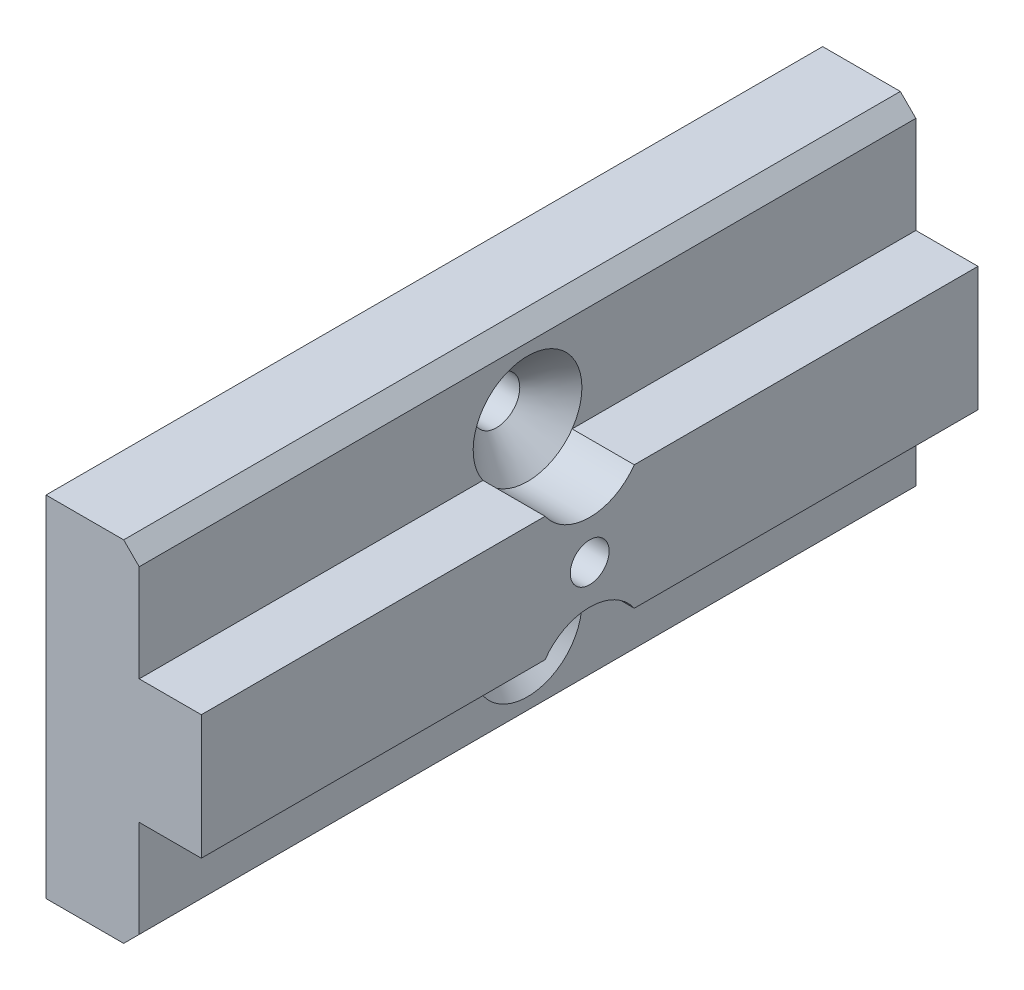
ISO-10303-21;
HEADER;
FILE_DESCRIPTION(('STEP AP214'),'2;1');
FILE_NAME('part.step','',(''),(''),'','','');
FILE_SCHEMA(('AUTOMOTIVE_DESIGN { 1 0 10303 214 1 1 1 1 }'));
ENDSEC;
DATA;
#1=APPLICATION_CONTEXT('core data for automotive mechanical design processes');
#2=APPLICATION_PROTOCOL_DEFINITION('international standard','automotive_design',2000,#1);
#3=PRODUCT_CONTEXT('',#1,'mechanical');
#4=PRODUCT('Part','Part','',(#3));
#5=PRODUCT_RELATED_PRODUCT_CATEGORY('part','',(#4));
#6=PRODUCT_DEFINITION_FORMATION('','',#4);
#7=PRODUCT_DEFINITION_CONTEXT('part definition',#1,'design');
#8=PRODUCT_DEFINITION('design','',#6,#7);
#9=PRODUCT_DEFINITION_SHAPE('','',#8);
#10=(LENGTH_UNIT() NAMED_UNIT(*) SI_UNIT(.MILLI.,.METRE.));
#11=(NAMED_UNIT(*) PLANE_ANGLE_UNIT() SI_UNIT($,.RADIAN.));
#12=(NAMED_UNIT(*) SI_UNIT($,.STERADIAN.) SOLID_ANGLE_UNIT());
#13=UNCERTAINTY_MEASURE_WITH_UNIT(LENGTH_MEASURE(1.E-05),#10,'distance_accuracy_value','');
#14=(GEOMETRIC_REPRESENTATION_CONTEXT(3) GLOBAL_UNCERTAINTY_ASSIGNED_CONTEXT((#13)) GLOBAL_UNIT_ASSIGNED_CONTEXT((#10,
#11,#12)) REPRESENTATION_CONTEXT('',''));
#15=CARTESIAN_POINT('',(0.,0.,0.));
#16=DIRECTION('',(0.,0.,1.));
#17=DIRECTION('',(1.,0.,0.));
#18=AXIS2_PLACEMENT_3D('',#15,#16,#17);
#19=CARTESIAN_POINT('',(10.,-4.,-25.));
#20=DIRECTION('',(0.,1.,0.));
#21=DIRECTION('',(0.,0.,1.));
#22=AXIS2_PLACEMENT_3D('',#19,#20,#21);
#23=PLANE('',#22);
#24=DIRECTION('',(-1.,0.,0.));
#25=VECTOR('',#24,1.);
#26=CARTESIAN_POINT('',(10.,-4.,-2.87228132326901));
#27=LINE('',#26,#25);
#28=CARTESIAN_POINT('',(6.,-4.,-2.87228132326901));
#29=VERTEX_POINT('',#28);
#30=CARTESIAN_POINT('',(10.,-4.,-2.87228132326901));
#31=VERTEX_POINT('',#30);
#32=EDGE_CURVE('E298',#29,#31,#27,.F.);
#33=ORIENTED_EDGE('',*,*,#32,.F.);
#34=DIRECTION('',(0.,0.,-1.));
#35=VECTOR('',#34,1.);
#36=CARTESIAN_POINT('',(6.,-4.,-25.));
#37=LINE('',#36,#35);
#38=CARTESIAN_POINT('',(6.,-4.,-25.));
#39=VERTEX_POINT('',#38);
#40=EDGE_CURVE('E184',#29,#39,#37,.T.);
#41=ORIENTED_EDGE('',*,*,#40,.T.);
#42=DIRECTION('',(-1.,0.,0.));
#43=VECTOR('',#42,1.);
#44=CARTESIAN_POINT('',(10.,-4.,-25.));
#45=LINE('',#44,#43);
#46=CARTESIAN_POINT('',(10.,-4.,-25.));
#47=VERTEX_POINT('',#46);
#48=EDGE_CURVE('E196',#47,#39,#45,.T.);
#49=ORIENTED_EDGE('',*,*,#48,.F.);
#50=DIRECTION('',(0.,0.,-1.));
#51=VECTOR('',#50,1.);
#52=CARTESIAN_POINT('',(10.,-4.,-25.));
#53=LINE('',#52,#51);
#54=EDGE_CURVE('E277',#31,#47,#53,.T.);
#55=ORIENTED_EDGE('',*,*,#54,.F.);
#56=EDGE_LOOP('',(#33,#41,#49,#55));
#57=FACE_BOUND('',#56,.T.);
#58=ADVANCED_FACE('F38',(#57),#23,.F.);
#59=DIRECTION('',(-1.,0.,0.));
#60=VECTOR('',#59,1.);
#61=CARTESIAN_POINT('',(10.,-4.,2.87228132326902));
#62=LINE('',#61,#60);
#63=CARTESIAN_POINT('',(10.,-4.,2.87228132326902));
#64=VERTEX_POINT('',#63);
#65=CARTESIAN_POINT('',(6.,-4.,2.87228132326902));
#66=VERTEX_POINT('',#65);
#67=EDGE_CURVE('E294',#64,#66,#62,.T.);
#68=ORIENTED_EDGE('',*,*,#67,.F.);
#69=CARTESIAN_POINT('',(10.,-4.,25.));
#70=VERTEX_POINT('',#69);
#71=EDGE_CURVE('E280',#70,#64,#53,.T.);
#72=ORIENTED_EDGE('',*,*,#71,.F.);
#73=DIRECTION('',(-1.,0.,0.));
#74=VECTOR('',#73,1.);
#75=CARTESIAN_POINT('',(10.,-4.,25.));
#76=LINE('',#75,#74);
#77=CARTESIAN_POINT('',(6.,-4.,25.));
#78=VERTEX_POINT('',#77);
#79=EDGE_CURVE('E200',#70,#78,#76,.T.);
#80=ORIENTED_EDGE('',*,*,#79,.T.);
#81=EDGE_CURVE('E178',#78,#66,#37,.T.);
#82=ORIENTED_EDGE('',*,*,#81,.T.);
#83=EDGE_LOOP('',(#68,#72,#80,#82));
#84=FACE_BOUND('',#83,.T.);
#85=ADVANCED_FACE('F360',(#84),#23,.F.);
#86=CARTESIAN_POINT('',(10.,4.,-25.));
#87=DIRECTION('',(0.,-1.,0.));
#88=DIRECTION('',(0.,0.,-1.));
#89=AXIS2_PLACEMENT_3D('',#86,#87,#88);
#90=PLANE('',#89);
#91=DIRECTION('',(-1.,0.,0.));
#92=VECTOR('',#91,1.);
#93=CARTESIAN_POINT('',(10.,4.,2.87228132326902));
#94=LINE('',#93,#92);
#95=CARTESIAN_POINT('',(6.,4.,2.87228132326902));
#96=VERTEX_POINT('',#95);
#97=CARTESIAN_POINT('',(10.,4.,2.87228132326902));
#98=VERTEX_POINT('',#97);
#99=EDGE_CURVE('E153',#96,#98,#94,.F.);
#100=ORIENTED_EDGE('',*,*,#99,.F.);
#101=DIRECTION('',(0.,0.,1.));
#102=VECTOR('',#101,1.);
#103=CARTESIAN_POINT('',(6.,4.,-25.));
#104=LINE('',#103,#102);
#105=CARTESIAN_POINT('',(6.,4.,25.));
#106=VERTEX_POINT('',#105);
#107=EDGE_CURVE('E167',#96,#106,#104,.T.);
#108=ORIENTED_EDGE('',*,*,#107,.T.);
#109=DIRECTION('',(-1.,0.,0.));
#110=VECTOR('',#109,1.);
#111=CARTESIAN_POINT('',(10.,4.,25.));
#112=LINE('',#111,#110);
#113=CARTESIAN_POINT('',(10.,4.,25.));
#114=VERTEX_POINT('',#113);
#115=EDGE_CURVE('E188',#114,#106,#112,.T.);
#116=ORIENTED_EDGE('',*,*,#115,.F.);
#117=DIRECTION('',(0.,0.,1.));
#118=VECTOR('',#117,1.);
#119=CARTESIAN_POINT('',(10.,4.,-25.));
#120=LINE('',#119,#118);
#121=EDGE_CURVE('E169',#98,#114,#120,.T.);
#122=ORIENTED_EDGE('',*,*,#121,.F.);
#123=EDGE_LOOP('',(#100,#108,#116,#122));
#124=FACE_BOUND('',#123,.T.);
#125=ADVANCED_FACE('F165',(#124),#90,.F.);
#126=DIRECTION('',(-1.,0.,0.));
#127=VECTOR('',#126,1.);
#128=CARTESIAN_POINT('',(10.,4.,-2.87228132326901));
#129=LINE('',#128,#127);
#130=CARTESIAN_POINT('',(10.,4.,-2.87228132326901));
#131=VERTEX_POINT('',#130);
#132=CARTESIAN_POINT('',(6.,4.,-2.87228132326901));
#133=VERTEX_POINT('',#132);
#134=EDGE_CURVE('E156',#131,#133,#129,.T.);
#135=ORIENTED_EDGE('',*,*,#134,.F.);
#136=CARTESIAN_POINT('',(10.,4.,-25.));
#137=VERTEX_POINT('',#136);
#138=EDGE_CURVE('E192',#137,#131,#120,.T.);
#139=ORIENTED_EDGE('',*,*,#138,.F.);
#140=DIRECTION('',(-1.,0.,0.));
#141=VECTOR('',#140,1.);
#142=CARTESIAN_POINT('',(10.,4.,-25.));
#143=LINE('',#142,#141);
#144=CARTESIAN_POINT('',(6.,4.,-25.));
#145=VERTEX_POINT('',#144);
#146=EDGE_CURVE('E191',#137,#145,#143,.T.);
#147=ORIENTED_EDGE('',*,*,#146,.T.);
#148=EDGE_CURVE('E177',#145,#133,#104,.T.);
#149=ORIENTED_EDGE('',*,*,#148,.T.);
#150=EDGE_LOOP('',(#135,#139,#147,#149));
#151=FACE_BOUND('',#150,.T.);
#152=ADVANCED_FACE('F377',(#151),#90,.F.);
#153=CARTESIAN_POINT('',(6.,0.,0.));
#154=DIRECTION('',(1.,0.,0.));
#155=DIRECTION('',(0.,0.,-1.));
#156=AXIS2_PLACEMENT_3D('',#153,#154,#155);
#157=PLANE('',#156);
#158=DIRECTION('',(0.,1.,0.));
#159=VECTOR('',#158,1.);
#160=CARTESIAN_POINT('',(6.,-11.25,-25.));
#161=LINE('',#160,#159);
#162=CARTESIAN_POINT('',(6.,10.25,-25.));
#163=VERTEX_POINT('',#162);
#164=EDGE_CURVE('E207',#145,#163,#161,.T.);
#165=ORIENTED_EDGE('',*,*,#164,.T.);
#166=DIRECTION('',(0.,0.,1.));
#167=VECTOR('',#166,1.);
#168=CARTESIAN_POINT('',(6.,10.25,25.));
#169=LINE('',#168,#167);
#170=CARTESIAN_POINT('',(6.,10.25,25.));
#171=VERTEX_POINT('',#170);
#172=EDGE_CURVE('E47',#163,#171,#169,.T.);
#173=ORIENTED_EDGE('',*,*,#172,.T.);
#174=DIRECTION('',(0.,-1.,0.));
#175=VECTOR('',#174,1.);
#176=CARTESIAN_POINT('',(6.,-11.25,25.));
#177=LINE('',#176,#175);
#178=EDGE_CURVE('E175',#171,#106,#177,.T.);
#179=ORIENTED_EDGE('',*,*,#178,.T.);
#180=ORIENTED_EDGE('',*,*,#107,.F.);
#181=CARTESIAN_POINT('',(6.,6.,0.));
#182=DIRECTION('',(1.,0.,0.));
#183=DIRECTION('',(0.,0.,-1.));
#184=AXIS2_PLACEMENT_3D('',#181,#182,#183);
#185=CIRCLE('',#184,3.50000000000002);
#186=EDGE_CURVE('E138',#96,#133,#185,.F.);
#187=ORIENTED_EDGE('',*,*,#186,.T.);
#188=ORIENTED_EDGE('',*,*,#148,.F.);
#189=EDGE_LOOP('',(#165,#173,#179,#180,#187,#188));
#190=FACE_BOUND('',#189,.T.);
#191=ADVANCED_FACE('F174',(#190),#157,.T.);
#192=CARTESIAN_POINT('',(6.,-11.25,25.));
#193=DIRECTION('',(0.,0.,-1.));
#194=DIRECTION('',(-1.,0.,0.));
#195=AXIS2_PLACEMENT_3D('',#192,#193,#194);
#196=PLANE('',#195);
#197=DIRECTION('',(-1.,0.,0.));
#198=VECTOR('',#197,1.);
#199=CARTESIAN_POINT('',(6.,-11.25,25.));
#200=LINE('',#199,#198);
#201=CARTESIAN_POINT('',(4.99999999999999,-11.25,25.));
#202=VERTEX_POINT('',#201);
#203=CARTESIAN_POINT('',(0.,-11.25,25.));
#204=VERTEX_POINT('',#203);
#205=EDGE_CURVE('E236',#202,#204,#200,.T.);
#206=ORIENTED_EDGE('',*,*,#205,.F.);
#207=DIRECTION('',(0.707106781186547,0.707106781186548,0.));
#208=VECTOR('',#207,1.);
#209=CARTESIAN_POINT('',(6.,-10.25,25.));
#210=LINE('',#209,#208);
#211=CARTESIAN_POINT('',(6.,-10.25,25.));
#212=VERTEX_POINT('',#211);
#213=EDGE_CURVE('E263',#202,#212,#210,.T.);
#214=ORIENTED_EDGE('',*,*,#213,.T.);
#215=EDGE_CURVE('E208',#78,#212,#177,.T.);
#216=ORIENTED_EDGE('',*,*,#215,.F.);
#217=ORIENTED_EDGE('',*,*,#79,.F.);
#218=DIRECTION('',(0.,-1.,0.));
#219=VECTOR('',#218,1.);
#220=CARTESIAN_POINT('',(10.,-4.,25.));
#221=LINE('',#220,#219);
#222=EDGE_CURVE('E182',#114,#70,#221,.T.);
#223=ORIENTED_EDGE('',*,*,#222,.F.);
#224=ORIENTED_EDGE('',*,*,#115,.T.);
#225=ORIENTED_EDGE('',*,*,#178,.F.);
#226=DIRECTION('',(-0.707106781186548,0.707106781186548,0.));
#227=VECTOR('',#226,1.);
#228=CARTESIAN_POINT('',(6.,10.25,25.));
#229=LINE('',#228,#227);
#230=CARTESIAN_POINT('',(5.,11.25,25.));
#231=VERTEX_POINT('',#230);
#232=EDGE_CURVE('E54',#171,#231,#229,.T.);
#233=ORIENTED_EDGE('',*,*,#232,.T.);
#234=DIRECTION('',(-1.,0.,0.));
#235=VECTOR('',#234,1.);
#236=CARTESIAN_POINT('',(6.,11.25,25.));
#237=LINE('',#236,#235);
#238=CARTESIAN_POINT('',(0.,11.25,25.));
#239=VERTEX_POINT('',#238);
#240=EDGE_CURVE('E212',#231,#239,#237,.T.);
#241=ORIENTED_EDGE('',*,*,#240,.T.);
#242=DIRECTION('',(0.,-1.,0.));
#243=VECTOR('',#242,1.);
#244=CARTESIAN_POINT('',(0.,-11.25,25.));
#245=LINE('',#244,#243);
#246=EDGE_CURVE('E204',#239,#204,#245,.T.);
#247=ORIENTED_EDGE('',*,*,#246,.T.);
#248=EDGE_LOOP('',(#206,#214,#216,#217,#223,#224,#225,#233,#241,#247));
#249=FACE_BOUND('',#248,.T.);
#250=ADVANCED_FACE('F269',(#249),#196,.F.);
#251=CARTESIAN_POINT('',(6.,-11.25,-25.));
#252=DIRECTION('',(0.,1.,0.));
#253=DIRECTION('',(0.,0.,1.));
#254=AXIS2_PLACEMENT_3D('',#251,#252,#253);
#255=PLANE('',#254);
#256=DIRECTION('',(-1.,0.,0.));
#257=VECTOR('',#256,1.);
#258=CARTESIAN_POINT('',(6.,-11.25,-25.));
#259=LINE('',#258,#257);
#260=CARTESIAN_POINT('',(4.99999999999999,-11.25,-25.));
#261=VERTEX_POINT('',#260);
#262=CARTESIAN_POINT('',(0.,-11.25,-25.));
#263=VERTEX_POINT('',#262);
#264=EDGE_CURVE('E233',#261,#263,#259,.T.);
#265=ORIENTED_EDGE('',*,*,#264,.F.);
#266=DIRECTION('',(0.,0.,1.));
#267=VECTOR('',#266,1.);
#268=CARTESIAN_POINT('',(4.99999999999999,-11.25,25.));
#269=LINE('',#268,#267);
#270=EDGE_CURVE('E258',#261,#202,#269,.T.);
#271=ORIENTED_EDGE('',*,*,#270,.T.);
#272=ORIENTED_EDGE('',*,*,#205,.T.);
#273=DIRECTION('',(0.,0.,-1.));
#274=VECTOR('',#273,1.);
#275=CARTESIAN_POINT('',(0.,-11.25,-25.));
#276=LINE('',#275,#274);
#277=EDGE_CURVE('E216',#204,#263,#276,.T.);
#278=ORIENTED_EDGE('',*,*,#277,.T.);
#279=EDGE_LOOP('',(#265,#271,#272,#278));
#280=FACE_BOUND('',#279,.T.);
#281=ADVANCED_FACE('F349',(#280),#255,.F.);
#282=CARTESIAN_POINT('',(6.,-11.25,-25.));
#283=DIRECTION('',(0.,0.,1.));
#284=DIRECTION('',(1.,0.,0.));
#285=AXIS2_PLACEMENT_3D('',#282,#283,#284);
#286=PLANE('',#285);
#287=CARTESIAN_POINT('',(6.,-10.25,-25.));
#288=VERTEX_POINT('',#287);
#289=EDGE_CURVE('E209',#288,#39,#161,.T.);
#290=ORIENTED_EDGE('',*,*,#289,.F.);
#291=DIRECTION('',(-0.707106781186547,-0.707106781186548,0.));
#292=VECTOR('',#291,1.);
#293=CARTESIAN_POINT('',(6.,-10.25,-25.));
#294=LINE('',#293,#292);
#295=EDGE_CURVE('E255',#288,#261,#294,.T.);
#296=ORIENTED_EDGE('',*,*,#295,.T.);
#297=ORIENTED_EDGE('',*,*,#264,.T.);
#298=DIRECTION('',(0.,1.,0.));
#299=VECTOR('',#298,1.);
#300=CARTESIAN_POINT('',(0.,-11.25,-25.));
#301=LINE('',#300,#299);
#302=CARTESIAN_POINT('',(0.,11.25,-25.));
#303=VERTEX_POINT('',#302);
#304=EDGE_CURVE('E220',#263,#303,#301,.T.);
#305=ORIENTED_EDGE('',*,*,#304,.T.);
#306=DIRECTION('',(-1.,0.,0.));
#307=VECTOR('',#306,1.);
#308=CARTESIAN_POINT('',(6.,11.25,-25.));
#309=LINE('',#308,#307);
#310=CARTESIAN_POINT('',(5.,11.25,-25.));
#311=VERTEX_POINT('',#310);
#312=EDGE_CURVE('E230',#311,#303,#309,.T.);
#313=ORIENTED_EDGE('',*,*,#312,.F.);
#314=DIRECTION('',(0.707106781186548,-0.707106781186548,0.));
#315=VECTOR('',#314,1.);
#316=CARTESIAN_POINT('',(6.,10.25,-25.));
#317=LINE('',#316,#315);
#318=EDGE_CURVE('E252',#311,#163,#317,.T.);
#319=ORIENTED_EDGE('',*,*,#318,.T.);
#320=ORIENTED_EDGE('',*,*,#164,.F.);
#321=ORIENTED_EDGE('',*,*,#146,.F.);
#322=DIRECTION('',(0.,1.,0.));
#323=VECTOR('',#322,1.);
#324=CARTESIAN_POINT('',(10.,-4.,-25.));
#325=LINE('',#324,#323);
#326=EDGE_CURVE('E286',#47,#137,#325,.T.);
#327=ORIENTED_EDGE('',*,*,#326,.F.);
#328=ORIENTED_EDGE('',*,*,#48,.T.);
#329=EDGE_LOOP('',(#290,#296,#297,#305,#313,#319,#320,#321,#327,#328));
#330=FACE_BOUND('',#329,.T.);
#331=ADVANCED_FACE('F345',(#330),#286,.F.);
#332=CARTESIAN_POINT('',(6.,11.25,-25.));
#333=DIRECTION('',(0.,-1.,0.));
#334=DIRECTION('',(0.,0.,-1.));
#335=AXIS2_PLACEMENT_3D('',#332,#333,#334);
#336=PLANE('',#335);
#337=ORIENTED_EDGE('',*,*,#240,.F.);
#338=DIRECTION('',(0.,0.,-1.));
#339=VECTOR('',#338,1.);
#340=CARTESIAN_POINT('',(5.,11.25,-25.));
#341=LINE('',#340,#339);
#342=EDGE_CURVE('E11',#231,#311,#341,.T.);
#343=ORIENTED_EDGE('',*,*,#342,.T.);
#344=ORIENTED_EDGE('',*,*,#312,.T.);
#345=DIRECTION('',(0.,0.,1.));
#346=VECTOR('',#345,1.);
#347=CARTESIAN_POINT('',(0.,11.25,-25.));
#348=LINE('',#347,#346);
#349=EDGE_CURVE('E224',#303,#239,#348,.T.);
#350=ORIENTED_EDGE('',*,*,#349,.T.);
#351=EDGE_LOOP('',(#337,#343,#344,#350));
#352=FACE_BOUND('',#351,.T.);
#353=ADVANCED_FACE('F341',(#352),#336,.F.);
#354=ORIENTED_EDGE('',*,*,#215,.T.);
#355=DIRECTION('',(0.,0.,-1.));
#356=VECTOR('',#355,1.);
#357=CARTESIAN_POINT('',(6.,-10.25,-25.));
#358=LINE('',#357,#356);
#359=EDGE_CURVE('E147',#212,#288,#358,.T.);
#360=ORIENTED_EDGE('',*,*,#359,.T.);
#361=ORIENTED_EDGE('',*,*,#289,.T.);
#362=ORIENTED_EDGE('',*,*,#40,.F.);
#363=CARTESIAN_POINT('',(6.,-6.,0.));
#364=DIRECTION('',(1.,0.,0.));
#365=DIRECTION('',(0.,0.,-1.));
#366=AXIS2_PLACEMENT_3D('',#363,#364,#365);
#367=CIRCLE('',#366,3.50000000000002);
#368=EDGE_CURVE('E243',#29,#66,#367,.F.);
#369=ORIENTED_EDGE('',*,*,#368,.T.);
#370=ORIENTED_EDGE('',*,*,#81,.F.);
#371=EDGE_LOOP('',(#354,#360,#361,#362,#369,#370));
#372=FACE_BOUND('',#371,.T.);
#373=ADVANCED_FACE('F332',(#372),#157,.T.);
#374=CARTESIAN_POINT('',(0.,0.,0.));
#375=DIRECTION('',(1.,0.,0.));
#376=DIRECTION('',(0.,0.,-1.));
#377=AXIS2_PLACEMENT_3D('',#374,#375,#376);
#378=PLANE('',#377);
#379=CARTESIAN_POINT('',(0.,6.,0.));
#380=DIRECTION('',(-1.,0.,0.));
#381=DIRECTION('',(0.,0.,1.));
#382=AXIS2_PLACEMENT_3D('',#379,#380,#381);
#383=CIRCLE('',#382,1.5);
#384=CARTESIAN_POINT('',(0.,6.,1.5));
#385=VERTEX_POINT('',#384);
#386=EDGE_CURVE('E311',#385,#385,#383,.T.);
#387=ORIENTED_EDGE('',*,*,#386,.F.);
#388=EDGE_LOOP('',(#387));
#389=FACE_BOUND('',#388,.T.);
#390=CARTESIAN_POINT('',(0.,-6.,0.));
#391=DIRECTION('',(-1.,0.,0.));
#392=DIRECTION('',(0.,0.,1.));
#393=AXIS2_PLACEMENT_3D('',#390,#391,#392);
#394=CIRCLE('',#393,1.5);
#395=CARTESIAN_POINT('',(0.,-6.,1.5));
#396=VERTEX_POINT('',#395);
#397=EDGE_CURVE('E315',#396,#396,#394,.T.);
#398=ORIENTED_EDGE('',*,*,#397,.F.);
#399=EDGE_LOOP('',(#398));
#400=FACE_BOUND('',#399,.T.);
#401=CARTESIAN_POINT('',(0.,0.,0.));
#402=DIRECTION('',(-1.,0.,0.));
#403=DIRECTION('',(0.,0.,1.));
#404=AXIS2_PLACEMENT_3D('',#401,#402,#403);
#405=CIRCLE('',#404,1.25);
#406=CARTESIAN_POINT('',(0.,0.,1.25));
#407=VERTEX_POINT('',#406);
#408=EDGE_CURVE('E171',#407,#407,#405,.T.);
#409=ORIENTED_EDGE('',*,*,#408,.F.);
#410=EDGE_LOOP('',(#409));
#411=FACE_BOUND('',#410,.T.);
#412=ORIENTED_EDGE('',*,*,#246,.F.);
#413=ORIENTED_EDGE('',*,*,#349,.F.);
#414=ORIENTED_EDGE('',*,*,#304,.F.);
#415=ORIENTED_EDGE('',*,*,#277,.F.);
#416=EDGE_LOOP('',(#412,#413,#414,#415));
#417=FACE_BOUND('',#416,.T.);
#418=ADVANCED_FACE('F329',(#389,#400,#411,#417),#378,.F.);
#419=CARTESIAN_POINT('',(10.,0.,0.));
#420=DIRECTION('',(1.,0.,0.));
#421=DIRECTION('',(0.,0.,-1.));
#422=AXIS2_PLACEMENT_3D('',#419,#420,#421);
#423=PLANE('',#422);
#424=CARTESIAN_POINT('',(10.,0.,0.));
#425=DIRECTION('',(-1.,0.,0.));
#426=DIRECTION('',(0.,0.,1.));
#427=AXIS2_PLACEMENT_3D('',#424,#425,#426);
#428=CIRCLE('',#427,1.25);
#429=CARTESIAN_POINT('',(10.,0.,1.25));
#430=VERTEX_POINT('',#429);
#431=EDGE_CURVE('E318',#430,#430,#428,.T.);
#432=ORIENTED_EDGE('',*,*,#431,.T.);
#433=EDGE_LOOP('',(#432));
#434=FACE_BOUND('',#433,.T.);
#435=ORIENTED_EDGE('',*,*,#138,.T.);
#436=CARTESIAN_POINT('',(10.,6.,0.));
#437=DIRECTION('',(1.,0.,0.));
#438=DIRECTION('',(0.,0.,-1.));
#439=AXIS2_PLACEMENT_3D('',#436,#437,#438);
#440=CIRCLE('',#439,3.5);
#441=EDGE_CURVE('E159',#98,#131,#440,.T.);
#442=ORIENTED_EDGE('',*,*,#441,.F.);
#443=ORIENTED_EDGE('',*,*,#121,.T.);
#444=ORIENTED_EDGE('',*,*,#222,.T.);
#445=ORIENTED_EDGE('',*,*,#71,.T.);
#446=CARTESIAN_POINT('',(10.,-6.,0.));
#447=DIRECTION('',(1.,0.,0.));
#448=DIRECTION('',(0.,0.,-1.));
#449=AXIS2_PLACEMENT_3D('',#446,#447,#448);
#450=CIRCLE('',#449,3.5);
#451=EDGE_CURVE('E160',#31,#64,#450,.T.);
#452=ORIENTED_EDGE('',*,*,#451,.F.);
#453=ORIENTED_EDGE('',*,*,#54,.T.);
#454=ORIENTED_EDGE('',*,*,#326,.T.);
#455=EDGE_LOOP('',(#435,#442,#443,#444,#445,#452,#453,#454));
#456=FACE_BOUND('',#455,.T.);
#457=ADVANCED_FACE('F292',(#434,#456),#423,.T.);
#458=CARTESIAN_POINT('',(10.,0.,0.));
#459=DIRECTION('',(-1.,0.,0.));
#460=DIRECTION('',(0.,0.,1.));
#461=AXIS2_PLACEMENT_3D('',#458,#459,#460);
#462=CYLINDRICAL_SURFACE('',#461,1.25);
#463=ORIENTED_EDGE('',*,*,#431,.F.);
#464=EDGE_LOOP('',(#463));
#465=FACE_BOUND('',#464,.T.);
#466=ORIENTED_EDGE('',*,*,#408,.T.);
#467=EDGE_LOOP('',(#466));
#468=FACE_BOUND('',#467,.T.);
#469=ADVANCED_FACE('F327',(#465,#468),#462,.F.);
#470=CARTESIAN_POINT('',(10.,-6.,0.));
#471=DIRECTION('',(-1.,0.,0.));
#472=DIRECTION('',(0.,0.,1.));
#473=AXIS2_PLACEMENT_3D('',#470,#471,#472);
#474=CYLINDRICAL_SURFACE('',#473,1.5);
#475=CARTESIAN_POINT('',(3.99999999999998,-6.,0.));
#476=DIRECTION('',(1.,0.,0.));
#477=DIRECTION('',(0.,0.,-1.));
#478=AXIS2_PLACEMENT_3D('',#475,#476,#477);
#479=CIRCLE('',#478,1.5);
#480=CARTESIAN_POINT('',(3.99999999999998,-6.,-1.5));
#481=VERTEX_POINT('',#480);
#482=EDGE_CURVE('E239',#481,#481,#479,.T.);
#483=ORIENTED_EDGE('',*,*,#482,.T.);
#484=EDGE_LOOP('',(#483));
#485=FACE_BOUND('',#484,.T.);
#486=ORIENTED_EDGE('',*,*,#397,.T.);
#487=EDGE_LOOP('',(#486));
#488=FACE_BOUND('',#487,.T.);
#489=ADVANCED_FACE('F480',(#485,#488),#474,.F.);
#490=CARTESIAN_POINT('',(10.,6.,0.));
#491=DIRECTION('',(-1.,0.,0.));
#492=DIRECTION('',(0.,0.,1.));
#493=AXIS2_PLACEMENT_3D('',#490,#491,#492);
#494=CYLINDRICAL_SURFACE('',#493,1.5);
#495=CARTESIAN_POINT('',(3.99999999999998,6.,0.));
#496=DIRECTION('',(1.,0.,0.));
#497=DIRECTION('',(0.,0.,-1.));
#498=AXIS2_PLACEMENT_3D('',#495,#496,#497);
#499=CIRCLE('',#498,1.5);
#500=CARTESIAN_POINT('',(3.99999999999998,6.,-1.5));
#501=VERTEX_POINT('',#500);
#502=EDGE_CURVE('E148',#501,#501,#499,.T.);
#503=ORIENTED_EDGE('',*,*,#502,.T.);
#504=EDGE_LOOP('',(#503));
#505=FACE_BOUND('',#504,.T.);
#506=ORIENTED_EDGE('',*,*,#386,.T.);
#507=EDGE_LOOP('',(#506));
#508=FACE_BOUND('',#507,.T.);
#509=ADVANCED_FACE('F472',(#505,#508),#494,.F.);
#510=CARTESIAN_POINT('',(10.,-6.,0.));
#511=DIRECTION('',(-1.,0.,0.));
#512=DIRECTION('',(0.,0.,1.));
#513=AXIS2_PLACEMENT_3D('',#510,#511,#512);
#514=CYLINDRICAL_SURFACE('',#513,3.5);
#515=ORIENTED_EDGE('',*,*,#32,.T.);
#516=ORIENTED_EDGE('',*,*,#451,.T.);
#517=ORIENTED_EDGE('',*,*,#67,.T.);
#518=CARTESIAN_POINT('',(6.,-6.,0.));
#519=DIRECTION('',(1.,0.,0.));
#520=DIRECTION('',(0.,0.,-1.));
#521=AXIS2_PLACEMENT_3D('',#518,#519,#520);
#522=CIRCLE('',#521,3.5);
#523=EDGE_CURVE('E303',#29,#66,#522,.T.);
#524=ORIENTED_EDGE('',*,*,#523,.F.);
#525=EDGE_LOOP('',(#515,#516,#517,#524));
#526=FACE_BOUND('',#525,.T.);
#527=ADVANCED_FACE('F367',(#526),#514,.F.);
#528=CARTESIAN_POINT('',(10.,6.,0.));
#529=DIRECTION('',(-1.,0.,0.));
#530=DIRECTION('',(0.,0.,1.));
#531=AXIS2_PLACEMENT_3D('',#528,#529,#530);
#532=CYLINDRICAL_SURFACE('',#531,3.5);
#533=ORIENTED_EDGE('',*,*,#99,.T.);
#534=ORIENTED_EDGE('',*,*,#441,.T.);
#535=ORIENTED_EDGE('',*,*,#134,.T.);
#536=CARTESIAN_POINT('',(6.,6.,0.));
#537=DIRECTION('',(1.,0.,0.));
#538=DIRECTION('',(0.,0.,-1.));
#539=AXIS2_PLACEMENT_3D('',#536,#537,#538);
#540=CIRCLE('',#539,3.5);
#541=EDGE_CURVE('E142',#96,#133,#540,.T.);
#542=ORIENTED_EDGE('',*,*,#541,.F.);
#543=EDGE_LOOP('',(#533,#534,#535,#542));
#544=FACE_BOUND('',#543,.T.);
#545=ADVANCED_FACE('F152',(#544),#532,.F.);
#546=CARTESIAN_POINT('',(3.99999999999998,-6.,0.));
#547=DIRECTION('',(1.,0.,0.));
#548=DIRECTION('',(0.,0.,-1.));
#549=AXIS2_PLACEMENT_3D('',#546,#547,#548);
#550=CONICAL_SURFACE('',#549,1.5,0.78539816339745);
#551=ORIENTED_EDGE('',*,*,#368,.F.);
#552=ORIENTED_EDGE('',*,*,#523,.T.);
#553=EDGE_LOOP('',(#551,#552));
#554=FACE_BOUND('',#553,.T.);
#555=ORIENTED_EDGE('',*,*,#482,.F.);
#556=EDGE_LOOP('',(#555));
#557=FACE_BOUND('',#556,.T.);
#558=ADVANCED_FACE('F363',(#554,#557),#550,.F.);
#559=CARTESIAN_POINT('',(3.99999999999998,6.,0.));
#560=DIRECTION('',(1.,0.,0.));
#561=DIRECTION('',(0.,0.,-1.));
#562=AXIS2_PLACEMENT_3D('',#559,#560,#561);
#563=CONICAL_SURFACE('',#562,1.5,0.78539816339745);
#564=ORIENTED_EDGE('',*,*,#186,.F.);
#565=ORIENTED_EDGE('',*,*,#541,.T.);
#566=EDGE_LOOP('',(#564,#565));
#567=FACE_BOUND('',#566,.T.);
#568=ORIENTED_EDGE('',*,*,#502,.F.);
#569=EDGE_LOOP('',(#568));
#570=FACE_BOUND('',#569,.T.);
#571=ADVANCED_FACE('F140',(#567,#570),#563,.F.);
#572=CARTESIAN_POINT('',(6.,-10.25,0.));
#573=DIRECTION('',(0.707106781186548,-0.707106781186547,0.));
#574=DIRECTION('',(0.,0.,1.));
#575=AXIS2_PLACEMENT_3D('',#572,#573,#574);
#576=PLANE('',#575);
#577=ORIENTED_EDGE('',*,*,#213,.F.);
#578=ORIENTED_EDGE('',*,*,#270,.F.);
#579=ORIENTED_EDGE('',*,*,#295,.F.);
#580=ORIENTED_EDGE('',*,*,#359,.F.);
#581=EDGE_LOOP('',(#577,#578,#579,#580));
#582=FACE_BOUND('',#581,.T.);
#583=ADVANCED_FACE('F351',(#582),#576,.T.);
#584=CARTESIAN_POINT('',(6.,10.25,0.));
#585=DIRECTION('',(0.707106781186547,0.707106781186547,0.));
#586=DIRECTION('',(0.,0.,-1.));
#587=AXIS2_PLACEMENT_3D('',#584,#585,#586);
#588=PLANE('',#587);
#589=ORIENTED_EDGE('',*,*,#318,.F.);
#590=ORIENTED_EDGE('',*,*,#342,.F.);
#591=ORIENTED_EDGE('',*,*,#232,.F.);
#592=ORIENTED_EDGE('',*,*,#172,.F.);
#593=EDGE_LOOP('',(#589,#590,#591,#592));
#594=FACE_BOUND('',#593,.T.);
#595=ADVANCED_FACE('F40',(#594),#588,.T.);
#596=CLOSED_SHELL('',(#58,#85,#125,#152,#191,#250,#281,#331,#353,#373,#418,#457,#469,#489,#509,
#527,#545,#558,#571,#583,#595));
#597=MANIFOLD_SOLID_BREP('B2',#596);
#598=ADVANCED_BREP_SHAPE_REPRESENTATION('',(#18,#597),#14);
#599=SHAPE_DEFINITION_REPRESENTATION(#9,#598);
ENDSEC;
END-ISO-10303-21;
